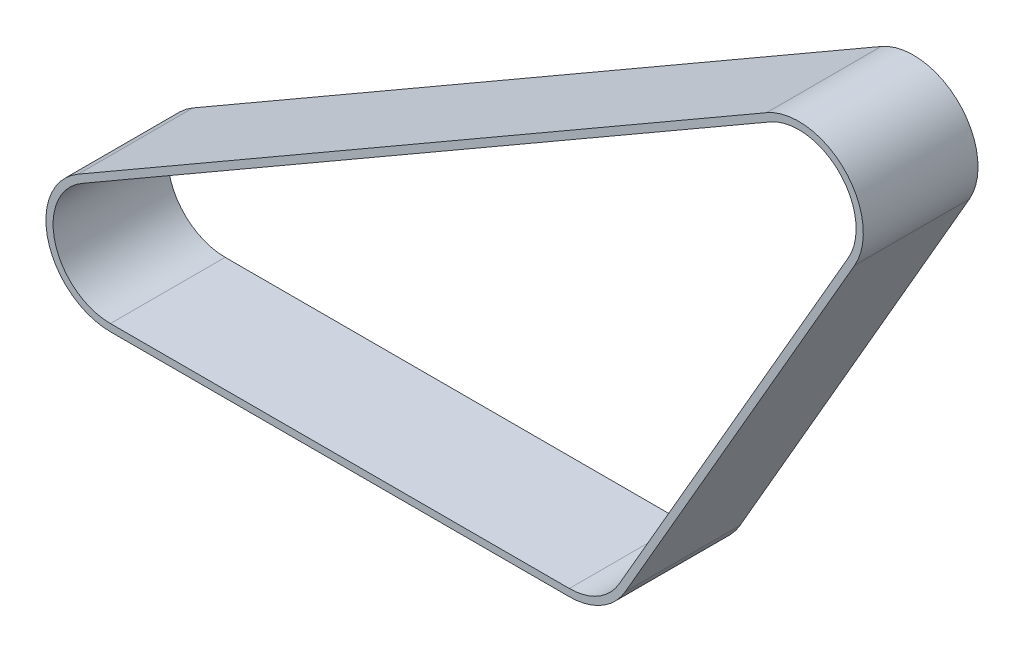
ISO-10303-21;
HEADER;
FILE_DESCRIPTION(('STEP AP214'),'2;1');
FILE_NAME('part.step','',(''),(''),'','','');
FILE_SCHEMA(('AUTOMOTIVE_DESIGN { 1 0 10303 214 1 1 1 1 }'));
ENDSEC;
DATA;
#1=APPLICATION_CONTEXT('core data for automotive mechanical design processes');
#2=APPLICATION_PROTOCOL_DEFINITION('international standard','automotive_design',2000,#1);
#3=PRODUCT_CONTEXT('',#1,'mechanical');
#4=PRODUCT('Part','Part','',(#3));
#5=PRODUCT_RELATED_PRODUCT_CATEGORY('part','',(#4));
#6=PRODUCT_DEFINITION_FORMATION('','',#4);
#7=PRODUCT_DEFINITION_CONTEXT('part definition',#1,'design');
#8=PRODUCT_DEFINITION('design','',#6,#7);
#9=PRODUCT_DEFINITION_SHAPE('','',#8);
#10=(LENGTH_UNIT() NAMED_UNIT(*) SI_UNIT(.MILLI.,.METRE.));
#11=(NAMED_UNIT(*) PLANE_ANGLE_UNIT() SI_UNIT($,.RADIAN.));
#12=(NAMED_UNIT(*) SI_UNIT($,.STERADIAN.) SOLID_ANGLE_UNIT());
#13=UNCERTAINTY_MEASURE_WITH_UNIT(LENGTH_MEASURE(1.E-05),#10,'distance_accuracy_value','');
#14=(GEOMETRIC_REPRESENTATION_CONTEXT(3) GLOBAL_UNCERTAINTY_ASSIGNED_CONTEXT((#13)) GLOBAL_UNIT_ASSIGNED_CONTEXT((#10,
#11,#12)) REPRESENTATION_CONTEXT('',''));
#15=CARTESIAN_POINT('',(0.,0.,0.));
#16=DIRECTION('',(0.,0.,1.));
#17=DIRECTION('',(1.,0.,0.));
#18=AXIS2_PLACEMENT_3D('',#15,#16,#17);
#19=CARTESIAN_POINT('',(0.,0.,25.4));
#20=DIRECTION('',(0.,0.,1.));
#21=DIRECTION('',(1.,0.,0.));
#22=AXIS2_PLACEMENT_3D('',#19,#20,#21);
#23=PLANE('',#22);
#24=CARTESIAN_POINT('',(0.,0.,25.4));
#25=DIRECTION('',(0.,0.,1.));
#26=DIRECTION('',(1.,0.,0.));
#27=AXIS2_PLACEMENT_3D('',#24,#25,#26);
#28=CIRCLE('',#27,14.2875);
#29=CARTESIAN_POINT('',(0.,-14.2875,25.4));
#30=VERTEX_POINT('',#29);
#31=CARTESIAN_POINT('',(12.3733379565702,-7.14374999999997,25.4));
#32=VERTEX_POINT('',#31);
#33=EDGE_CURVE('E173',#30,#32,#28,.T.);
#34=ORIENTED_EDGE('',*,*,#33,.T.);
#35=DIRECTION('',(0.499999999999998,0.866025403784439,0.));
#36=VECTOR('',#35,1.);
#37=CARTESIAN_POINT('',(12.3733379565702,-7.14374999999997,25.4));
#38=LINE('',#37,#36);
#39=CARTESIAN_POINT('',(63.1733379565701,80.8444310244992,25.4));
#40=VERTEX_POINT('',#39);
#41=EDGE_CURVE('E176',#32,#40,#38,.T.);
#42=ORIENTED_EDGE('',*,*,#41,.T.);
#43=CARTESIAN_POINT('',(50.7999999999999,87.9881810244992,25.4));
#44=DIRECTION('',(0.,0.,1.));
#45=DIRECTION('',(1.,0.,0.));
#46=AXIS2_PLACEMENT_3D('',#43,#44,#45);
#47=CIRCLE('',#46,14.2875);
#48=CARTESIAN_POINT('',(43.6562499999999,100.361518981069,25.4));
#49=VERTEX_POINT('',#48);
#50=EDGE_CURVE('E179',#40,#49,#47,.T.);
#51=ORIENTED_EDGE('',*,*,#50,.T.);
#52=DIRECTION('',(-0.866025403784438,-0.500000000000001,0.));
#53=VECTOR('',#52,1.);
#54=CARTESIAN_POINT('',(43.6562499999999,100.361518981069,25.4));
#55=LINE('',#54,#53);
#56=CARTESIAN_POINT('',(-108.74375,12.3733379565702,25.4));
#57=VERTEX_POINT('',#56);
#58=EDGE_CURVE('E181',#49,#57,#55,.T.);
#59=ORIENTED_EDGE('',*,*,#58,.T.);
#60=CARTESIAN_POINT('',(-101.6,0.,25.4));
#61=DIRECTION('',(0.,0.,1.));
#62=DIRECTION('',(1.,0.,0.));
#63=AXIS2_PLACEMENT_3D('',#60,#61,#62);
#64=CIRCLE('',#63,14.2875);
#65=CARTESIAN_POINT('',(-101.6,-14.2875,25.4));
#66=VERTEX_POINT('',#65);
#67=EDGE_CURVE('E183',#57,#66,#64,.T.);
#68=ORIENTED_EDGE('',*,*,#67,.T.);
#69=DIRECTION('',(1.,0.,0.));
#70=VECTOR('',#69,1.);
#71=CARTESIAN_POINT('',(-101.6,-14.2875,25.4));
#72=LINE('',#71,#70);
#73=EDGE_CURVE('E185',#66,#30,#72,.T.);
#74=ORIENTED_EDGE('',*,*,#73,.T.);
#75=EDGE_LOOP('',(#34,#42,#51,#59,#68,#74));
#76=FACE_BOUND('',#75,.T.);
#77=DIRECTION('',(1.,0.,0.));
#78=VECTOR('',#77,1.);
#79=CARTESIAN_POINT('',(-101.6,-12.7,25.4));
#80=LINE('',#79,#78);
#81=CARTESIAN_POINT('',(-101.6,-12.7,25.4));
#82=VERTEX_POINT('',#81);
#83=CARTESIAN_POINT('',(0.,-12.7,25.4));
#84=VERTEX_POINT('',#83);
#85=EDGE_CURVE('E130',#82,#84,#80,.T.);
#86=ORIENTED_EDGE('',*,*,#85,.F.);
#87=CARTESIAN_POINT('',(-101.6,0.,25.4));
#88=DIRECTION('',(0.,0.,1.));
#89=DIRECTION('',(1.,0.,0.));
#90=AXIS2_PLACEMENT_3D('',#87,#88,#89);
#91=CIRCLE('',#90,12.7);
#92=CARTESIAN_POINT('',(-107.95,10.9985226280623,25.4));
#93=VERTEX_POINT('',#92);
#94=EDGE_CURVE('E122',#93,#82,#91,.T.);
#95=ORIENTED_EDGE('',*,*,#94,.F.);
#96=DIRECTION('',(-0.866025403784438,-0.500000000000001,0.));
#97=VECTOR('',#96,1.);
#98=CARTESIAN_POINT('',(-107.95,10.9985226280623,25.4));
#99=LINE('',#98,#97);
#100=CARTESIAN_POINT('',(44.4499999999999,98.9867036525615,25.4));
#101=VERTEX_POINT('',#100);
#102=EDGE_CURVE('E151',#101,#93,#99,.T.);
#103=ORIENTED_EDGE('',*,*,#102,.F.);
#104=CARTESIAN_POINT('',(50.7999999999999,87.9881810244992,25.4));
#105=DIRECTION('',(0.,0.,1.));
#106=DIRECTION('',(1.,0.,0.));
#107=AXIS2_PLACEMENT_3D('',#104,#105,#106);
#108=CIRCLE('',#107,12.7);
#109=CARTESIAN_POINT('',(61.7985226280623,81.6381810244992,25.4));
#110=VERTEX_POINT('',#109);
#111=EDGE_CURVE('E149',#110,#101,#108,.T.);
#112=ORIENTED_EDGE('',*,*,#111,.F.);
#113=DIRECTION('',(0.499999999999998,0.86602540378444,0.));
#114=VECTOR('',#113,1.);
#115=CARTESIAN_POINT('',(61.7985226280623,81.6381810244992,25.4));
#116=LINE('',#115,#114);
#117=CARTESIAN_POINT('',(10.9985226280624,-6.34999999999997,25.4));
#118=VERTEX_POINT('',#117);
#119=EDGE_CURVE('E145',#118,#110,#116,.T.);
#120=ORIENTED_EDGE('',*,*,#119,.F.);
#121=CARTESIAN_POINT('',(0.,0.,25.4));
#122=DIRECTION('',(0.,0.,1.));
#123=DIRECTION('',(1.,0.,0.));
#124=AXIS2_PLACEMENT_3D('',#121,#122,#123);
#125=CIRCLE('',#124,12.7);
#126=EDGE_CURVE('E143',#84,#118,#125,.T.);
#127=ORIENTED_EDGE('',*,*,#126,.F.);
#128=EDGE_LOOP('',(#86,#95,#103,#112,#120,#127));
#129=FACE_BOUND('',#128,.T.);
#130=ADVANCED_FACE('F33',(#76,#129),#23,.T.);
#131=CARTESIAN_POINT('',(0.,0.,0.));
#132=DIRECTION('',(0.,0.,1.));
#133=DIRECTION('',(1.,0.,0.));
#134=AXIS2_PLACEMENT_3D('',#131,#132,#133);
#135=PLANE('',#134);
#136=CARTESIAN_POINT('',(0.,0.,0.));
#137=DIRECTION('',(0.,0.,1.));
#138=DIRECTION('',(1.,0.,0.));
#139=AXIS2_PLACEMENT_3D('',#136,#137,#138);
#140=CIRCLE('',#139,14.2875);
#141=CARTESIAN_POINT('',(0.,-14.2875,0.));
#142=VERTEX_POINT('',#141);
#143=CARTESIAN_POINT('',(12.3733379565702,-7.14374999999997,0.));
#144=VERTEX_POINT('',#143);
#145=EDGE_CURVE('E138',#142,#144,#140,.T.);
#146=ORIENTED_EDGE('',*,*,#145,.F.);
#147=DIRECTION('',(1.,0.,0.));
#148=VECTOR('',#147,1.);
#149=CARTESIAN_POINT('',(-101.6,-14.2875,0.));
#150=LINE('',#149,#148);
#151=CARTESIAN_POINT('',(-101.6,-14.2875,0.));
#152=VERTEX_POINT('',#151);
#153=EDGE_CURVE('E177',#152,#142,#150,.T.);
#154=ORIENTED_EDGE('',*,*,#153,.F.);
#155=CARTESIAN_POINT('',(-101.6,0.,0.));
#156=DIRECTION('',(0.,0.,1.));
#157=DIRECTION('',(1.,0.,0.));
#158=AXIS2_PLACEMENT_3D('',#155,#156,#157);
#159=CIRCLE('',#158,14.2875);
#160=CARTESIAN_POINT('',(-108.74375,12.3733379565702,0.));
#161=VERTEX_POINT('',#160);
#162=EDGE_CURVE('E196',#161,#152,#159,.T.);
#163=ORIENTED_EDGE('',*,*,#162,.F.);
#164=DIRECTION('',(-0.866025403784438,-0.500000000000001,0.));
#165=VECTOR('',#164,1.);
#166=CARTESIAN_POINT('',(43.6562499999999,100.361518981069,0.));
#167=LINE('',#166,#165);
#168=CARTESIAN_POINT('',(43.6562499999999,100.361518981069,0.));
#169=VERTEX_POINT('',#168);
#170=EDGE_CURVE('E194',#169,#161,#167,.T.);
#171=ORIENTED_EDGE('',*,*,#170,.F.);
#172=CARTESIAN_POINT('',(50.7999999999999,87.9881810244992,0.));
#173=DIRECTION('',(0.,0.,1.));
#174=DIRECTION('',(1.,0.,0.));
#175=AXIS2_PLACEMENT_3D('',#172,#173,#174);
#176=CIRCLE('',#175,14.2875);
#177=CARTESIAN_POINT('',(63.1733379565701,80.8444310244992,0.));
#178=VERTEX_POINT('',#177);
#179=EDGE_CURVE('E192',#178,#169,#176,.T.);
#180=ORIENTED_EDGE('',*,*,#179,.F.);
#181=DIRECTION('',(0.499999999999998,0.866025403784439,0.));
#182=VECTOR('',#181,1.);
#183=CARTESIAN_POINT('',(12.3733379565702,-7.14374999999997,0.));
#184=LINE('',#183,#182);
#185=EDGE_CURVE('E190',#144,#178,#184,.T.);
#186=ORIENTED_EDGE('',*,*,#185,.F.);
#187=EDGE_LOOP('',(#146,#154,#163,#171,#180,#186));
#188=FACE_BOUND('',#187,.T.);
#189=CARTESIAN_POINT('',(-101.6,0.,0.));
#190=DIRECTION('',(0.,0.,1.));
#191=DIRECTION('',(1.,0.,0.));
#192=AXIS2_PLACEMENT_3D('',#189,#190,#191);
#193=CIRCLE('',#192,12.7);
#194=CARTESIAN_POINT('',(-107.95,10.9985226280623,0.));
#195=VERTEX_POINT('',#194);
#196=CARTESIAN_POINT('',(-101.6,-12.7,0.));
#197=VERTEX_POINT('',#196);
#198=EDGE_CURVE('E56',#195,#197,#193,.T.);
#199=ORIENTED_EDGE('',*,*,#198,.T.);
#200=DIRECTION('',(1.,0.,0.));
#201=VECTOR('',#200,1.);
#202=CARTESIAN_POINT('',(-101.6,-12.7,0.));
#203=LINE('',#202,#201);
#204=CARTESIAN_POINT('',(0.,-12.7,0.));
#205=VERTEX_POINT('',#204);
#206=EDGE_CURVE('E137',#197,#205,#203,.T.);
#207=ORIENTED_EDGE('',*,*,#206,.T.);
#208=CARTESIAN_POINT('',(0.,0.,0.));
#209=DIRECTION('',(0.,0.,1.));
#210=DIRECTION('',(1.,0.,0.));
#211=AXIS2_PLACEMENT_3D('',#208,#209,#210);
#212=CIRCLE('',#211,12.7);
#213=CARTESIAN_POINT('',(10.9985226280624,-6.34999999999997,0.));
#214=VERTEX_POINT('',#213);
#215=EDGE_CURVE('E155',#205,#214,#212,.T.);
#216=ORIENTED_EDGE('',*,*,#215,.T.);
#217=DIRECTION('',(0.499999999999998,0.86602540378444,0.));
#218=VECTOR('',#217,1.);
#219=CARTESIAN_POINT('',(61.7985226280623,81.6381810244992,0.));
#220=LINE('',#219,#218);
#221=CARTESIAN_POINT('',(61.7985226280623,81.6381810244992,0.));
#222=VERTEX_POINT('',#221);
#223=EDGE_CURVE('E158',#214,#222,#220,.T.);
#224=ORIENTED_EDGE('',*,*,#223,.T.);
#225=CARTESIAN_POINT('',(50.7999999999999,87.9881810244992,0.));
#226=DIRECTION('',(0.,0.,1.));
#227=DIRECTION('',(1.,0.,0.));
#228=AXIS2_PLACEMENT_3D('',#225,#226,#227);
#229=CIRCLE('',#228,12.7);
#230=CARTESIAN_POINT('',(44.4499999999999,98.9867036525615,0.));
#231=VERTEX_POINT('',#230);
#232=EDGE_CURVE('E161',#222,#231,#229,.T.);
#233=ORIENTED_EDGE('',*,*,#232,.T.);
#234=DIRECTION('',(-0.866025403784438,-0.500000000000001,0.));
#235=VECTOR('',#234,1.);
#236=CARTESIAN_POINT('',(-107.95,10.9985226280623,0.));
#237=LINE('',#236,#235);
#238=EDGE_CURVE('E131',#231,#195,#237,.T.);
#239=ORIENTED_EDGE('',*,*,#238,.T.);
#240=EDGE_LOOP('',(#199,#207,#216,#224,#233,#239));
#241=FACE_BOUND('',#240,.T.);
#242=ADVANCED_FACE('F220',(#188,#241),#135,.F.);
#243=CARTESIAN_POINT('',(0.,0.,25.4));
#244=DIRECTION('',(0.,0.,-1.));
#245=DIRECTION('',(-1.,0.,0.));
#246=AXIS2_PLACEMENT_3D('',#243,#244,#245);
#247=CYLINDRICAL_SURFACE('',#246,14.2875);
#248=ORIENTED_EDGE('',*,*,#145,.T.);
#249=DIRECTION('',(0.,0.,-1.));
#250=VECTOR('',#249,1.);
#251=CARTESIAN_POINT('',(12.3733379565702,-7.14374999999997,25.4));
#252=LINE('',#251,#250);
#253=EDGE_CURVE('E11',#32,#144,#252,.T.);
#254=ORIENTED_EDGE('',*,*,#253,.F.);
#255=ORIENTED_EDGE('',*,*,#33,.F.);
#256=DIRECTION('',(0.,0.,-1.));
#257=VECTOR('',#256,1.);
#258=CARTESIAN_POINT('',(0.,-14.2875,25.4));
#259=LINE('',#258,#257);
#260=EDGE_CURVE('E187',#30,#142,#259,.T.);
#261=ORIENTED_EDGE('',*,*,#260,.T.);
#262=EDGE_LOOP('',(#248,#254,#255,#261));
#263=FACE_BOUND('',#262,.T.);
#264=ADVANCED_FACE('F35',(#263),#247,.T.);
#265=CARTESIAN_POINT('',(12.3733379565702,-7.14374999999997,25.4));
#266=DIRECTION('',(-0.866025403784439,0.499999999999998,0.));
#267=DIRECTION('',(-0.499999999999998,-0.86602540378444,0.));
#268=AXIS2_PLACEMENT_3D('',#265,#266,#267);
#269=PLANE('',#268);
#270=ORIENTED_EDGE('',*,*,#185,.T.);
#271=DIRECTION('',(0.,0.,-1.));
#272=VECTOR('',#271,1.);
#273=CARTESIAN_POINT('',(63.1733379565701,80.8444310244992,25.4));
#274=LINE('',#273,#272);
#275=EDGE_CURVE('E41',#40,#178,#274,.T.);
#276=ORIENTED_EDGE('',*,*,#275,.F.);
#277=ORIENTED_EDGE('',*,*,#41,.F.);
#278=ORIENTED_EDGE('',*,*,#253,.T.);
#279=EDGE_LOOP('',(#270,#276,#277,#278));
#280=FACE_BOUND('',#279,.T.);
#281=ADVANCED_FACE('F237',(#280),#269,.F.);
#282=CARTESIAN_POINT('',(50.7999999999999,87.9881810244992,25.4));
#283=DIRECTION('',(0.,0.,-1.));
#284=DIRECTION('',(-1.,0.,0.));
#285=AXIS2_PLACEMENT_3D('',#282,#283,#284);
#286=CYLINDRICAL_SURFACE('',#285,14.2875);
#287=ORIENTED_EDGE('',*,*,#179,.T.);
#288=DIRECTION('',(0.,0.,-1.));
#289=VECTOR('',#288,1.);
#290=CARTESIAN_POINT('',(43.6562499999999,100.361518981069,25.4));
#291=LINE('',#290,#289);
#292=EDGE_CURVE('E207',#49,#169,#291,.T.);
#293=ORIENTED_EDGE('',*,*,#292,.F.);
#294=ORIENTED_EDGE('',*,*,#50,.F.);
#295=ORIENTED_EDGE('',*,*,#275,.T.);
#296=EDGE_LOOP('',(#287,#293,#294,#295));
#297=FACE_BOUND('',#296,.T.);
#298=ADVANCED_FACE('F214',(#297),#286,.T.);
#299=CARTESIAN_POINT('',(43.6562499999999,100.361518981069,25.4));
#300=DIRECTION('',(0.500000000000001,-0.866025403784438,0.));
#301=DIRECTION('',(0.866025403784438,0.500000000000001,0.));
#302=AXIS2_PLACEMENT_3D('',#299,#300,#301);
#303=PLANE('',#302);
#304=ORIENTED_EDGE('',*,*,#170,.T.);
#305=DIRECTION('',(0.,0.,-1.));
#306=VECTOR('',#305,1.);
#307=CARTESIAN_POINT('',(-108.74375,12.3733379565702,25.4));
#308=LINE('',#307,#306);
#309=EDGE_CURVE('E204',#57,#161,#308,.T.);
#310=ORIENTED_EDGE('',*,*,#309,.F.);
#311=ORIENTED_EDGE('',*,*,#58,.F.);
#312=ORIENTED_EDGE('',*,*,#292,.T.);
#313=EDGE_LOOP('',(#304,#310,#311,#312));
#314=FACE_BOUND('',#313,.T.);
#315=ADVANCED_FACE('F226',(#314),#303,.F.);
#316=CARTESIAN_POINT('',(-101.6,0.,25.4));
#317=DIRECTION('',(0.,0.,-1.));
#318=DIRECTION('',(-1.,0.,0.));
#319=AXIS2_PLACEMENT_3D('',#316,#317,#318);
#320=CYLINDRICAL_SURFACE('',#319,14.2875);
#321=ORIENTED_EDGE('',*,*,#162,.T.);
#322=DIRECTION('',(0.,0.,-1.));
#323=VECTOR('',#322,1.);
#324=CARTESIAN_POINT('',(-101.6,-14.2875,25.4));
#325=LINE('',#324,#323);
#326=EDGE_CURVE('E201',#66,#152,#325,.T.);
#327=ORIENTED_EDGE('',*,*,#326,.F.);
#328=ORIENTED_EDGE('',*,*,#67,.F.);
#329=ORIENTED_EDGE('',*,*,#309,.T.);
#330=EDGE_LOOP('',(#321,#327,#328,#329));
#331=FACE_BOUND('',#330,.T.);
#332=ADVANCED_FACE('F230',(#331),#320,.T.);
#333=CARTESIAN_POINT('',(-101.6,-14.2875,25.4));
#334=DIRECTION('',(0.,1.,0.));
#335=DIRECTION('',(0.,0.,1.));
#336=AXIS2_PLACEMENT_3D('',#333,#334,#335);
#337=PLANE('',#336);
#338=ORIENTED_EDGE('',*,*,#153,.T.);
#339=ORIENTED_EDGE('',*,*,#260,.F.);
#340=ORIENTED_EDGE('',*,*,#73,.F.);
#341=ORIENTED_EDGE('',*,*,#326,.T.);
#342=EDGE_LOOP('',(#338,#339,#340,#341));
#343=FACE_BOUND('',#342,.T.);
#344=ADVANCED_FACE('F240',(#343),#337,.F.);
#345=CARTESIAN_POINT('',(-101.6,0.,25.4));
#346=DIRECTION('',(0.,0.,-1.));
#347=DIRECTION('',(-1.,0.,0.));
#348=AXIS2_PLACEMENT_3D('',#345,#346,#347);
#349=CYLINDRICAL_SURFACE('',#348,12.7);
#350=ORIENTED_EDGE('',*,*,#198,.F.);
#351=DIRECTION('',(0.,0.,-1.));
#352=VECTOR('',#351,1.);
#353=CARTESIAN_POINT('',(-107.95,10.9985226280623,25.4));
#354=LINE('',#353,#352);
#355=EDGE_CURVE('E126',#93,#195,#354,.T.);
#356=ORIENTED_EDGE('',*,*,#355,.F.);
#357=ORIENTED_EDGE('',*,*,#94,.T.);
#358=DIRECTION('',(0.,0.,-1.));
#359=VECTOR('',#358,1.);
#360=CARTESIAN_POINT('',(-101.6,-12.7,25.4));
#361=LINE('',#360,#359);
#362=EDGE_CURVE('E125',#82,#197,#361,.T.);
#363=ORIENTED_EDGE('',*,*,#362,.T.);
#364=EDGE_LOOP('',(#350,#356,#357,#363));
#365=FACE_BOUND('',#364,.T.);
#366=ADVANCED_FACE('F124',(#365),#349,.F.);
#367=CARTESIAN_POINT('',(-101.6,-12.7,25.4));
#368=DIRECTION('',(0.,1.,0.));
#369=DIRECTION('',(-1.,0.,0.));
#370=AXIS2_PLACEMENT_3D('',#367,#368,#369);
#371=PLANE('',#370);
#372=ORIENTED_EDGE('',*,*,#206,.F.);
#373=ORIENTED_EDGE('',*,*,#362,.F.);
#374=ORIENTED_EDGE('',*,*,#85,.T.);
#375=DIRECTION('',(0.,0.,-1.));
#376=VECTOR('',#375,1.);
#377=CARTESIAN_POINT('',(0.,-12.7,25.4));
#378=LINE('',#377,#376);
#379=EDGE_CURVE('E139',#84,#205,#378,.T.);
#380=ORIENTED_EDGE('',*,*,#379,.T.);
#381=EDGE_LOOP('',(#372,#373,#374,#380));
#382=FACE_BOUND('',#381,.T.);
#383=ADVANCED_FACE('F134',(#382),#371,.T.);
#384=CARTESIAN_POINT('',(0.,0.,25.4));
#385=DIRECTION('',(0.,0.,-1.));
#386=DIRECTION('',(-1.,0.,0.));
#387=AXIS2_PLACEMENT_3D('',#384,#385,#386);
#388=CYLINDRICAL_SURFACE('',#387,12.7);
#389=ORIENTED_EDGE('',*,*,#215,.F.);
#390=ORIENTED_EDGE('',*,*,#379,.F.);
#391=ORIENTED_EDGE('',*,*,#126,.T.);
#392=DIRECTION('',(0.,0.,-1.));
#393=VECTOR('',#392,1.);
#394=CARTESIAN_POINT('',(10.9985226280624,-6.34999999999997,25.4));
#395=LINE('',#394,#393);
#396=EDGE_CURVE('E170',#118,#214,#395,.T.);
#397=ORIENTED_EDGE('',*,*,#396,.T.);
#398=EDGE_LOOP('',(#389,#390,#391,#397));
#399=FACE_BOUND('',#398,.T.);
#400=ADVANCED_FACE('F258',(#399),#388,.F.);
#401=CARTESIAN_POINT('',(61.7985226280623,81.6381810244992,25.4));
#402=DIRECTION('',(-0.86602540378444,0.499999999999998,0.));
#403=DIRECTION('',(-0.499999999999998,-0.86602540378444,0.));
#404=AXIS2_PLACEMENT_3D('',#401,#402,#403);
#405=PLANE('',#404);
#406=ORIENTED_EDGE('',*,*,#223,.F.);
#407=ORIENTED_EDGE('',*,*,#396,.F.);
#408=ORIENTED_EDGE('',*,*,#119,.T.);
#409=DIRECTION('',(0.,0.,-1.));
#410=VECTOR('',#409,1.);
#411=CARTESIAN_POINT('',(61.7985226280623,81.6381810244992,25.4));
#412=LINE('',#411,#410);
#413=EDGE_CURVE('E168',#110,#222,#412,.T.);
#414=ORIENTED_EDGE('',*,*,#413,.T.);
#415=EDGE_LOOP('',(#406,#407,#408,#414));
#416=FACE_BOUND('',#415,.T.);
#417=ADVANCED_FACE('F261',(#416),#405,.T.);
#418=CARTESIAN_POINT('',(50.7999999999999,87.9881810244992,25.4));
#419=DIRECTION('',(0.,0.,-1.));
#420=DIRECTION('',(-1.,0.,0.));
#421=AXIS2_PLACEMENT_3D('',#418,#419,#420);
#422=CYLINDRICAL_SURFACE('',#421,12.7);
#423=ORIENTED_EDGE('',*,*,#232,.F.);
#424=ORIENTED_EDGE('',*,*,#413,.F.);
#425=ORIENTED_EDGE('',*,*,#111,.T.);
#426=DIRECTION('',(0.,0.,-1.));
#427=VECTOR('',#426,1.);
#428=CARTESIAN_POINT('',(44.4499999999999,98.9867036525615,25.4));
#429=LINE('',#428,#427);
#430=EDGE_CURVE('E48',#101,#231,#429,.T.);
#431=ORIENTED_EDGE('',*,*,#430,.T.);
#432=EDGE_LOOP('',(#423,#424,#425,#431));
#433=FACE_BOUND('',#432,.T.);
#434=ADVANCED_FACE('F265',(#433),#422,.F.);
#435=CARTESIAN_POINT('',(-107.95,10.9985226280623,25.4));
#436=DIRECTION('',(0.500000000000001,-0.866025403784438,0.));
#437=DIRECTION('',(0.866025403784438,0.500000000000001,0.));
#438=AXIS2_PLACEMENT_3D('',#435,#436,#437);
#439=PLANE('',#438);
#440=ORIENTED_EDGE('',*,*,#238,.F.);
#441=ORIENTED_EDGE('',*,*,#430,.F.);
#442=ORIENTED_EDGE('',*,*,#102,.T.);
#443=ORIENTED_EDGE('',*,*,#355,.T.);
#444=EDGE_LOOP('',(#440,#441,#442,#443));
#445=FACE_BOUND('',#444,.T.);
#446=ADVANCED_FACE('F269',(#445),#439,.T.);
#447=CLOSED_SHELL('',(#130,#242,#264,#281,#298,#315,#332,#344,#366,#383,#400,#417,#434,#446));
#448=MANIFOLD_SOLID_BREP('B2',#447);
#449=ADVANCED_BREP_SHAPE_REPRESENTATION('',(#18,#448),#14);
#450=SHAPE_DEFINITION_REPRESENTATION(#9,#449);
ENDSEC;
END-ISO-10303-21;
